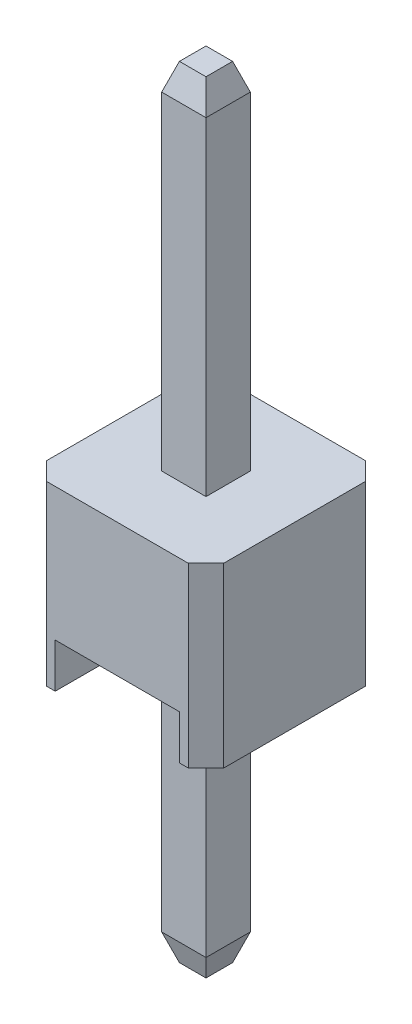
ISO-10303-21;
HEADER;
FILE_DESCRIPTION(('STEP AP214'),'2;1');
FILE_NAME('part.step','',(''),(''),'','','');
FILE_SCHEMA(('AUTOMOTIVE_DESIGN { 1 0 10303 214 1 1 1 1 }'));
ENDSEC;
DATA;
#1=APPLICATION_CONTEXT('core data for automotive mechanical design processes');
#2=APPLICATION_PROTOCOL_DEFINITION('international standard','automotive_design',2000,#1);
#3=PRODUCT_CONTEXT('',#1,'mechanical');
#4=PRODUCT('Part','Part','',(#3));
#5=PRODUCT_RELATED_PRODUCT_CATEGORY('part','',(#4));
#6=PRODUCT_DEFINITION_FORMATION('','',#4);
#7=PRODUCT_DEFINITION_CONTEXT('part definition',#1,'design');
#8=PRODUCT_DEFINITION('design','',#6,#7);
#9=PRODUCT_DEFINITION_SHAPE('','',#8);
#10=(LENGTH_UNIT() NAMED_UNIT(*) SI_UNIT(.MILLI.,.METRE.));
#11=(NAMED_UNIT(*) PLANE_ANGLE_UNIT() SI_UNIT($,.RADIAN.));
#12=(NAMED_UNIT(*) SI_UNIT($,.STERADIAN.) SOLID_ANGLE_UNIT());
#13=UNCERTAINTY_MEASURE_WITH_UNIT(LENGTH_MEASURE(1.E-05),#10,'distance_accuracy_value','');
#14=(GEOMETRIC_REPRESENTATION_CONTEXT(3) GLOBAL_UNCERTAINTY_ASSIGNED_CONTEXT((#13)) GLOBAL_UNIT_ASSIGNED_CONTEXT((#10,
#11,#12)) REPRESENTATION_CONTEXT('',''));
#15=CARTESIAN_POINT('',(0.,0.,0.));
#16=DIRECTION('',(0.,0.,1.));
#17=DIRECTION('',(1.,0.,0.));
#18=AXIS2_PLACEMENT_3D('',#15,#16,#17);
#19=CARTESIAN_POINT('',(1.261092051208,-0.01052284372211,3.146492385426));
#20=DIRECTION('',(0.,-0.316227766016653,0.948683298050575));
#21=DIRECTION('',(0.,0.948683298050575,0.316227766016653));
#22=AXIS2_PLACEMENT_3D('',#19,#20,#21);
#23=PLANE('',#22);
#24=DIRECTION('',(1.,0.,0.));
#25=VECTOR('',#24,1.);
#26=CARTESIAN_POINT('',(1.,0.,3.15));
#27=LINE('',#26,#25);
#28=CARTESIAN_POINT('',(0.849999999999959,0.,3.15));
#29=VERTEX_POINT('',#28);
#30=CARTESIAN_POINT('',(1.15000000000004,0.,3.15));
#31=VERTEX_POINT('',#30);
#32=EDGE_CURVE('E174',#29,#31,#27,.T.);
#33=ORIENTED_EDGE('',*,*,#32,.T.);
#34=DIRECTION('',(-0.301511344577576,-0.904534033733321,-0.301511344577863));
#35=VECTOR('',#34,1.);
#36=CARTESIAN_POINT('',(1.24999999999995,0.299999999999951,3.25));
#37=LINE('',#36,#35);
#38=CARTESIAN_POINT('',(1.24999999999998,0.30000000000004,3.25000000000002));
#39=VERTEX_POINT('',#38);
#40=EDGE_CURVE('E191',#39,#31,#37,.T.);
#41=ORIENTED_EDGE('',*,*,#40,.F.);
#42=DIRECTION('',(1.,0.,0.));
#43=VECTOR('',#42,1.);
#44=CARTESIAN_POINT('',(1.,0.3,3.25));
#45=LINE('',#44,#43);
#46=CARTESIAN_POINT('',(0.750000000000022,0.30000000000001,3.25000000000001));
#47=VERTEX_POINT('',#46);
#48=EDGE_CURVE('E188',#47,#39,#45,.T.);
#49=ORIENTED_EDGE('',*,*,#48,.F.);
#50=DIRECTION('',(-0.301511344577577,0.904534033733321,0.301511344577861));
#51=VECTOR('',#50,1.);
#52=CARTESIAN_POINT('',(0.849999999999953,0.,3.15));
#53=LINE('',#52,#51);
#54=EDGE_CURVE('E21',#29,#47,#53,.T.);
#55=ORIENTED_EDGE('',*,*,#54,.F.);
#56=EDGE_LOOP('',(#33,#41,#49,#55));
#57=FACE_BOUND('',#56,.T.);
#58=ADVANCED_FACE('F17',(#57),#23,.T.);
#59=CARTESIAN_POINT('',(1.161092051208,0.,2.838907948792));
#60=DIRECTION('',(0.,1.,0.));
#61=DIRECTION('',(-1.,0.,0.));
#62=AXIS2_PLACEMENT_3D('',#59,#60,#61);
#63=PLANE('',#62);
#64=DIRECTION('',(0.,0.,-1.));
#65=VECTOR('',#64,1.);
#66=CARTESIAN_POINT('',(1.15000000000005,0.,3.));
#67=LINE('',#66,#65);
#68=CARTESIAN_POINT('',(1.15000000000002,0.,2.84999999999995));
#69=VERTEX_POINT('',#68);
#70=EDGE_CURVE('E181',#31,#69,#67,.T.);
#71=ORIENTED_EDGE('',*,*,#70,.F.);
#72=ORIENTED_EDGE('',*,*,#32,.F.);
#73=DIRECTION('',(0.,0.,1.));
#74=VECTOR('',#73,1.);
#75=CARTESIAN_POINT('',(0.849999999999953,0.,3.));
#76=LINE('',#75,#74);
#77=CARTESIAN_POINT('',(0.849999999999976,0.,2.84999999999995));
#78=VERTEX_POINT('',#77);
#79=EDGE_CURVE('E178',#78,#29,#76,.T.);
#80=ORIENTED_EDGE('',*,*,#79,.F.);
#81=DIRECTION('',(-1.,0.,0.));
#82=VECTOR('',#81,1.);
#83=CARTESIAN_POINT('',(1.,0.,2.84999999999995));
#84=LINE('',#83,#82);
#85=EDGE_CURVE('E234',#69,#78,#84,.T.);
#86=ORIENTED_EDGE('',*,*,#85,.F.);
#87=EDGE_LOOP('',(#71,#72,#80,#86));
#88=FACE_BOUND('',#87,.T.);
#89=ADVANCED_FACE('F176',(#88),#63,.F.);
#90=CARTESIAN_POINT('',(0.853507614574,-0.01052284372211,3.261092051208));
#91=DIRECTION('',(-0.948683298050576,-0.316227766016652,0.));
#92=DIRECTION('',(-0.316227766016652,0.948683298050576,0.));
#93=AXIS2_PLACEMENT_3D('',#90,#91,#92);
#94=PLANE('',#93);
#95=DIRECTION('',(0.,0.,1.));
#96=VECTOR('',#95,1.);
#97=CARTESIAN_POINT('',(0.75,0.3,3.));
#98=LINE('',#97,#96);
#99=CARTESIAN_POINT('',(0.749999999999997,0.299999999999998,2.75000000000002));
#100=VERTEX_POINT('',#99);
#101=EDGE_CURVE('E205',#100,#47,#98,.T.);
#102=ORIENTED_EDGE('',*,*,#101,.F.);
#103=DIRECTION('',(-0.301511344577862,0.904534033733321,-0.301511344577576));
#104=VECTOR('',#103,1.);
#105=CARTESIAN_POINT('',(0.85,0.,2.84999999999995));
#106=LINE('',#105,#104);
#107=EDGE_CURVE('E194',#78,#100,#106,.T.);
#108=ORIENTED_EDGE('',*,*,#107,.F.);
#109=ORIENTED_EDGE('',*,*,#79,.T.);
#110=ORIENTED_EDGE('',*,*,#54,.T.);
#111=EDGE_LOOP('',(#102,#108,#109,#110));
#112=FACE_BOUND('',#111,.T.);
#113=ADVANCED_FACE('F192',(#112),#94,.T.);
#114=CARTESIAN_POINT('',(1.146492385426,-0.01052284372211,2.738907948792));
#115=DIRECTION('',(0.948683298050576,-0.316227766016651,0.));
#116=DIRECTION('',(0.316227766016651,0.948683298050576,0.));
#117=AXIS2_PLACEMENT_3D('',#114,#115,#116);
#118=PLANE('',#117);
#119=ORIENTED_EDGE('',*,*,#70,.T.);
#120=DIRECTION('',(-0.301511344577862,-0.904534033733321,0.301511344577576));
#121=VECTOR('',#120,1.);
#122=CARTESIAN_POINT('',(1.25,0.299999999999951,2.75000000000005));
#123=LINE('',#122,#121);
#124=CARTESIAN_POINT('',(1.25000000000002,0.300000000000041,2.75000000000002));
#125=VERTEX_POINT('',#124);
#126=EDGE_CURVE('E208',#125,#69,#123,.T.);
#127=ORIENTED_EDGE('',*,*,#126,.F.);
#128=DIRECTION('',(0.,0.,-1.));
#129=VECTOR('',#128,1.);
#130=CARTESIAN_POINT('',(1.25,0.3,3.));
#131=LINE('',#130,#129);
#132=EDGE_CURVE('E209',#39,#125,#131,.T.);
#133=ORIENTED_EDGE('',*,*,#132,.F.);
#134=ORIENTED_EDGE('',*,*,#40,.T.);
#135=EDGE_LOOP('',(#119,#127,#133,#134));
#136=FACE_BOUND('',#135,.T.);
#137=ADVANCED_FACE('F337',(#136),#118,.T.);
#138=CARTESIAN_POINT('',(0.738907948792,0.24,3.25));
#139=DIRECTION('',(0.,0.,1.));
#140=DIRECTION('',(1.,0.,0.));
#141=AXIS2_PLACEMENT_3D('',#138,#139,#140);
#142=PLANE('',#141);
#143=DIRECTION('',(-1.,0.,0.));
#144=VECTOR('',#143,1.);
#145=CARTESIAN_POINT('',(1.,3.3,3.25));
#146=LINE('',#145,#144);
#147=CARTESIAN_POINT('',(1.25,3.3,3.25000000000001));
#148=VERTEX_POINT('',#147);
#149=CARTESIAN_POINT('',(0.74999999999998,3.3,3.25));
#150=VERTEX_POINT('',#149);
#151=EDGE_CURVE('E200',#148,#150,#146,.T.);
#152=ORIENTED_EDGE('',*,*,#151,.T.);
#153=DIRECTION('',(0.,1.,0.));
#154=VECTOR('',#153,1.);
#155=CARTESIAN_POINT('',(0.75,1.8,3.25));
#156=LINE('',#155,#154);
#157=EDGE_CURVE('E201',#47,#150,#156,.T.);
#158=ORIENTED_EDGE('',*,*,#157,.F.);
#159=ORIENTED_EDGE('',*,*,#48,.T.);
#160=DIRECTION('',(0.,-1.,0.));
#161=VECTOR('',#160,1.);
#162=CARTESIAN_POINT('',(1.25,1.8,3.25000000000004));
#163=LINE('',#162,#161);
#164=EDGE_CURVE('E213',#148,#39,#163,.T.);
#165=ORIENTED_EDGE('',*,*,#164,.F.);
#166=EDGE_LOOP('',(#152,#158,#159,#165));
#167=FACE_BOUND('',#166,.T.);
#168=ADVANCED_FACE('F343',(#167),#142,.T.);
#169=CARTESIAN_POINT('',(2.04,2.8,1.96));
#170=DIRECTION('',(0.,1.,0.));
#171=DIRECTION('',(-1.,0.,0.));
#172=AXIS2_PLACEMENT_3D('',#169,#170,#171);
#173=PLANE('',#172);
#174=DIRECTION('',(-0.707106781186548,0.,0.707106781186547));
#175=VECTOR('',#174,1.);
#176=CARTESIAN_POINT('',(2.007843264626,2.8,3.792156735374));
#177=LINE('',#176,#175);
#178=CARTESIAN_POINT('',(1.80000000000021,2.8,3.99999999999979));
#179=VERTEX_POINT('',#178);
#180=CARTESIAN_POINT('',(2.,2.8,3.8));
#181=VERTEX_POINT('',#180);
#182=EDGE_CURVE('E220',#179,#181,#177,.F.);
#183=ORIENTED_EDGE('',*,*,#182,.F.);
#184=DIRECTION('',(1.,0.,0.));
#185=VECTOR('',#184,1.);
#186=CARTESIAN_POINT('',(1.,2.8,4.));
#187=LINE('',#186,#185);
#188=CARTESIAN_POINT('',(1.7,2.8,4.));
#189=VERTEX_POINT('',#188);
#190=EDGE_CURVE('E218',#189,#179,#187,.T.);
#191=ORIENTED_EDGE('',*,*,#190,.F.);
#192=DIRECTION('',(0.,0.,-1.));
#193=VECTOR('',#192,1.);
#194=CARTESIAN_POINT('',(1.7,2.8,3.));
#195=LINE('',#194,#193);
#196=CARTESIAN_POINT('',(1.7,2.8,2.));
#197=VERTEX_POINT('',#196);
#198=EDGE_CURVE('E216',#189,#197,#195,.T.);
#199=ORIENTED_EDGE('',*,*,#198,.T.);
#200=DIRECTION('',(-1.,0.,0.));
#201=VECTOR('',#200,1.);
#202=CARTESIAN_POINT('',(1.,2.8,2.));
#203=LINE('',#202,#201);
#204=CARTESIAN_POINT('',(1.80000000000021,2.8,2.00000000000021));
#205=VERTEX_POINT('',#204);
#206=EDGE_CURVE('E221',#205,#197,#203,.T.);
#207=ORIENTED_EDGE('',*,*,#206,.F.);
#208=DIRECTION('',(0.707106781186547,0.,0.707106781186548));
#209=VECTOR('',#208,1.);
#210=CARTESIAN_POINT('',(1.792156735374,2.8,1.992156735374));
#211=LINE('',#210,#209);
#212=CARTESIAN_POINT('',(2.,2.8,2.2));
#213=VERTEX_POINT('',#212);
#214=EDGE_CURVE('E244',#213,#205,#211,.F.);
#215=ORIENTED_EDGE('',*,*,#214,.F.);
#216=DIRECTION('',(0.,0.,-1.));
#217=VECTOR('',#216,1.);
#218=CARTESIAN_POINT('',(2.,2.8,3.));
#219=LINE('',#218,#217);
#220=EDGE_CURVE('E232',#181,#213,#219,.T.);
#221=ORIENTED_EDGE('',*,*,#220,.F.);
#222=EDGE_LOOP('',(#183,#191,#199,#207,#215,#221));
#223=FACE_BOUND('',#222,.T.);
#224=ADVANCED_FACE('F385',(#223),#173,.F.);
#225=CARTESIAN_POINT('',(0.738907948792,-0.01052284372211,2.853507614574));
#226=DIRECTION('',(0.,-0.316227766016651,-0.948683298050576));
#227=DIRECTION('',(0.,0.948683298050576,-0.316227766016651));
#228=AXIS2_PLACEMENT_3D('',#225,#226,#227);
#229=PLANE('',#228);
#230=DIRECTION('',(-1.,0.,0.));
#231=VECTOR('',#230,1.);
#232=CARTESIAN_POINT('',(1.,0.3,2.75));
#233=LINE('',#232,#231);
#234=EDGE_CURVE('E245',#125,#100,#233,.T.);
#235=ORIENTED_EDGE('',*,*,#234,.F.);
#236=ORIENTED_EDGE('',*,*,#126,.T.);
#237=ORIENTED_EDGE('',*,*,#85,.T.);
#238=ORIENTED_EDGE('',*,*,#107,.T.);
#239=EDGE_LOOP('',(#235,#236,#237,#238));
#240=FACE_BOUND('',#239,.T.);
#241=ADVANCED_FACE('F361',(#240),#229,.T.);
#242=CARTESIAN_POINT('',(0.75,0.24,2.738907948792));
#243=DIRECTION('',(-1.,0.,0.));
#244=DIRECTION('',(0.,0.,1.));
#245=AXIS2_PLACEMENT_3D('',#242,#243,#244);
#246=PLANE('',#245);
#247=DIRECTION('',(0.,0.,-1.));
#248=VECTOR('',#247,1.);
#249=CARTESIAN_POINT('',(0.75,3.3,3.));
#250=LINE('',#249,#248);
#251=CARTESIAN_POINT('',(0.75,3.3,2.74999999999998));
#252=VERTEX_POINT('',#251);
#253=EDGE_CURVE('E204',#150,#252,#250,.T.);
#254=ORIENTED_EDGE('',*,*,#253,.T.);
#255=DIRECTION('',(0.,1.,0.));
#256=VECTOR('',#255,1.);
#257=CARTESIAN_POINT('',(0.750000000000001,1.8,2.75));
#258=LINE('',#257,#256);
#259=EDGE_CURVE('E248',#100,#252,#258,.T.);
#260=ORIENTED_EDGE('',*,*,#259,.F.);
#261=ORIENTED_EDGE('',*,*,#101,.T.);
#262=ORIENTED_EDGE('',*,*,#157,.T.);
#263=EDGE_LOOP('',(#254,#260,#261,#262));
#264=FACE_BOUND('',#263,.T.);
#265=ADVANCED_FACE('F359',(#264),#246,.T.);
#266=CARTESIAN_POINT('',(1.25,0.24,3.261092051208));
#267=DIRECTION('',(1.,0.,0.));
#268=DIRECTION('',(0.,0.,-1.));
#269=AXIS2_PLACEMENT_3D('',#266,#267,#268);
#270=PLANE('',#269);
#271=DIRECTION('',(0.,0.,1.));
#272=VECTOR('',#271,1.);
#273=CARTESIAN_POINT('',(1.25,3.3,3.));
#274=LINE('',#273,#272);
#275=CARTESIAN_POINT('',(1.25000000000001,3.3,2.75));
#276=VERTEX_POINT('',#275);
#277=EDGE_CURVE('E212',#276,#148,#274,.T.);
#278=ORIENTED_EDGE('',*,*,#277,.T.);
#279=ORIENTED_EDGE('',*,*,#164,.T.);
#280=ORIENTED_EDGE('',*,*,#132,.T.);
#281=DIRECTION('',(0.,-1.,0.));
#282=VECTOR('',#281,1.);
#283=CARTESIAN_POINT('',(1.25000000000004,1.8,2.75));
#284=LINE('',#283,#282);
#285=EDGE_CURVE('E250',#276,#125,#284,.T.);
#286=ORIENTED_EDGE('',*,*,#285,.F.);
#287=EDGE_LOOP('',(#278,#279,#280,#286));
#288=FACE_BOUND('',#287,.T.);
#289=ADVANCED_FACE('F345',(#288),#270,.T.);
#290=CARTESIAN_POINT('',(1.7,3.311092051208,4.04));
#291=DIRECTION('',(1.,0.,0.));
#292=DIRECTION('',(0.,-1.,0.));
#293=AXIS2_PLACEMENT_3D('',#290,#291,#292);
#294=PLANE('',#293);
#295=DIRECTION('',(0.,0.,-1.));
#296=VECTOR('',#295,1.);
#297=CARTESIAN_POINT('',(1.7,3.3,3.));
#298=LINE('',#297,#296);
#299=CARTESIAN_POINT('',(1.7,3.30000000000001,4.));
#300=VERTEX_POINT('',#299);
#301=CARTESIAN_POINT('',(1.7,3.30000000000001,2.));
#302=VERTEX_POINT('',#301);
#303=EDGE_CURVE('E365',#300,#302,#298,.T.);
#304=ORIENTED_EDGE('',*,*,#303,.T.);
#305=DIRECTION('',(0.,1.,0.));
#306=VECTOR('',#305,1.);
#307=CARTESIAN_POINT('',(1.7,3.05,2.));
#308=LINE('',#307,#306);
#309=EDGE_CURVE('E377',#197,#302,#308,.T.);
#310=ORIENTED_EDGE('',*,*,#309,.F.);
#311=ORIENTED_EDGE('',*,*,#198,.F.);
#312=DIRECTION('',(0.,-1.,0.));
#313=VECTOR('',#312,1.);
#314=CARTESIAN_POINT('',(1.7,3.05,4.));
#315=LINE('',#314,#313);
#316=EDGE_CURVE('E249',#300,#189,#315,.T.);
#317=ORIENTED_EDGE('',*,*,#316,.F.);
#318=EDGE_LOOP('',(#304,#310,#311,#317));
#319=FACE_BOUND('',#318,.T.);
#320=ADVANCED_FACE('F389',(#319),#294,.F.);
#321=CARTESIAN_POINT('',(1.261092051208,0.24,2.75));
#322=DIRECTION('',(0.,0.,-1.));
#323=DIRECTION('',(-1.,0.,0.));
#324=AXIS2_PLACEMENT_3D('',#321,#322,#323);
#325=PLANE('',#324);
#326=DIRECTION('',(1.,0.,0.));
#327=VECTOR('',#326,1.);
#328=CARTESIAN_POINT('',(1.,3.3,2.75));
#329=LINE('',#328,#327);
#330=EDGE_CURVE('E356',#252,#276,#329,.T.);
#331=ORIENTED_EDGE('',*,*,#330,.T.);
#332=ORIENTED_EDGE('',*,*,#285,.T.);
#333=ORIENTED_EDGE('',*,*,#234,.T.);
#334=ORIENTED_EDGE('',*,*,#259,.T.);
#335=EDGE_LOOP('',(#331,#332,#333,#334));
#336=FACE_BOUND('',#335,.T.);
#337=ADVANCED_FACE('F363',(#336),#325,.T.);
#338=CARTESIAN_POINT('',(0.272,3.3,4.04));
#339=DIRECTION('',(0.,1.,0.));
#340=DIRECTION('',(1.,0.,0.));
#341=AXIS2_PLACEMENT_3D('',#338,#339,#340);
#342=PLANE('',#341);
#343=ORIENTED_EDGE('',*,*,#253,.F.);
#344=ORIENTED_EDGE('',*,*,#151,.F.);
#345=ORIENTED_EDGE('',*,*,#277,.F.);
#346=ORIENTED_EDGE('',*,*,#330,.F.);
#347=EDGE_LOOP('',(#343,#344,#345,#346));
#348=FACE_BOUND('',#347,.T.);
#349=DIRECTION('',(1.,0.,0.));
#350=VECTOR('',#349,1.);
#351=CARTESIAN_POINT('',(1.,3.3,4.));
#352=LINE('',#351,#350);
#353=CARTESIAN_POINT('',(0.3,3.3,4.));
#354=VERTEX_POINT('',#353);
#355=EDGE_CURVE('E370',#354,#300,#352,.T.);
#356=ORIENTED_EDGE('',*,*,#355,.F.);
#357=DIRECTION('',(0.,0.,-1.));
#358=VECTOR('',#357,1.);
#359=CARTESIAN_POINT('',(0.3,3.3,3.));
#360=LINE('',#359,#358);
#361=CARTESIAN_POINT('',(0.3,3.3,2.));
#362=VERTEX_POINT('',#361);
#363=EDGE_CURVE('E367',#354,#362,#360,.T.);
#364=ORIENTED_EDGE('',*,*,#363,.T.);
#365=DIRECTION('',(-1.,0.,0.));
#366=VECTOR('',#365,1.);
#367=CARTESIAN_POINT('',(1.,3.3,2.));
#368=LINE('',#367,#366);
#369=EDGE_CURVE('E253',#302,#362,#368,.T.);
#370=ORIENTED_EDGE('',*,*,#369,.F.);
#371=ORIENTED_EDGE('',*,*,#303,.F.);
#372=EDGE_LOOP('',(#356,#364,#370,#371));
#373=FACE_BOUND('',#372,.T.);
#374=ADVANCED_FACE('F354',(#348,#373),#342,.F.);
#375=CARTESIAN_POINT('',(0.3,2.788907948792,4.04));
#376=DIRECTION('',(-1.,0.,0.));
#377=DIRECTION('',(0.,1.,0.));
#378=AXIS2_PLACEMENT_3D('',#375,#376,#377);
#379=PLANE('',#378);
#380=ORIENTED_EDGE('',*,*,#363,.F.);
#381=DIRECTION('',(0.,1.,0.));
#382=VECTOR('',#381,1.);
#383=CARTESIAN_POINT('',(0.3,3.05,4.));
#384=LINE('',#383,#382);
#385=CARTESIAN_POINT('',(0.3,2.79999999999999,4.));
#386=VERTEX_POINT('',#385);
#387=EDGE_CURVE('E364',#386,#354,#384,.T.);
#388=ORIENTED_EDGE('',*,*,#387,.F.);
#389=DIRECTION('',(0.,0.,-1.));
#390=VECTOR('',#389,1.);
#391=CARTESIAN_POINT('',(0.3,2.8,3.));
#392=LINE('',#391,#390);
#393=CARTESIAN_POINT('',(0.3,2.79999999999998,2.));
#394=VERTEX_POINT('',#393);
#395=EDGE_CURVE('E274',#386,#394,#392,.T.);
#396=ORIENTED_EDGE('',*,*,#395,.T.);
#397=DIRECTION('',(0.,-1.,0.));
#398=VECTOR('',#397,1.);
#399=CARTESIAN_POINT('',(0.3,3.05,2.));
#400=LINE('',#399,#398);
#401=EDGE_CURVE('E330',#362,#394,#400,.T.);
#402=ORIENTED_EDGE('',*,*,#401,.F.);
#403=EDGE_LOOP('',(#380,#388,#396,#402));
#404=FACE_BOUND('',#403,.T.);
#405=ADVANCED_FACE('F404',(#404),#379,.F.);
#406=CARTESIAN_POINT('',(2.04,2.8,1.96));
#407=DIRECTION('',(0.,1.,0.));
#408=DIRECTION('',(-1.,0.,0.));
#409=AXIS2_PLACEMENT_3D('',#406,#407,#408);
#410=PLANE('',#409);
#411=ORIENTED_EDGE('',*,*,#395,.F.);
#412=DIRECTION('',(1.,0.,0.));
#413=VECTOR('',#412,1.);
#414=CARTESIAN_POINT('',(1.,2.8,4.));
#415=LINE('',#414,#413);
#416=CARTESIAN_POINT('',(0.200000000000185,2.8,4.));
#417=VERTEX_POINT('',#416);
#418=EDGE_CURVE('E272',#417,#386,#415,.T.);
#419=ORIENTED_EDGE('',*,*,#418,.F.);
#420=DIRECTION('',(-0.707106781187888,0.,-0.707106781185207));
#421=VECTOR('',#420,1.);
#422=CARTESIAN_POINT('',(0.2078432646264,2.8,4.007843264626));
#423=LINE('',#422,#421);
#424=CARTESIAN_POINT('',(0.,2.8,3.8000000000004));
#425=VERTEX_POINT('',#424);
#426=EDGE_CURVE('E275',#425,#417,#423,.F.);
#427=ORIENTED_EDGE('',*,*,#426,.F.);
#428=DIRECTION('',(0.,0.,1.));
#429=VECTOR('',#428,1.);
#430=CARTESIAN_POINT('',(0.,2.8,3.));
#431=LINE('',#430,#429);
#432=CARTESIAN_POINT('',(0.,2.8,2.1999999999996));
#433=VERTEX_POINT('',#432);
#434=EDGE_CURVE('E257',#433,#425,#431,.T.);
#435=ORIENTED_EDGE('',*,*,#434,.F.);
#436=DIRECTION('',(0.707106781187887,0.,-0.707106781185208));
#437=VECTOR('',#436,1.);
#438=CARTESIAN_POINT('',(-0.007843264626417,2.8,2.207843264626));
#439=LINE('',#438,#437);
#440=CARTESIAN_POINT('',(0.200000000000185,2.8,2.));
#441=VERTEX_POINT('',#440);
#442=EDGE_CURVE('E328',#441,#433,#439,.F.);
#443=ORIENTED_EDGE('',*,*,#442,.F.);
#444=DIRECTION('',(-1.,0.,0.));
#445=VECTOR('',#444,1.);
#446=CARTESIAN_POINT('',(1.,2.8,2.));
#447=LINE('',#446,#445);
#448=EDGE_CURVE('E261',#394,#441,#447,.T.);
#449=ORIENTED_EDGE('',*,*,#448,.F.);
#450=EDGE_LOOP('',(#411,#419,#427,#435,#443,#449));
#451=FACE_BOUND('',#450,.T.);
#452=ADVANCED_FACE('F409',(#451),#410,.F.);
#453=CARTESIAN_POINT('',(0.,2.76,2.168));
#454=DIRECTION('',(-1.,0.,0.));
#455=DIRECTION('',(0.,0.,1.));
#456=AXIS2_PLACEMENT_3D('',#453,#454,#455);
#457=PLANE('',#456);
#458=DIRECTION('',(0.,-1.,0.));
#459=VECTOR('',#458,1.);
#460=CARTESIAN_POINT('',(0.,3.8,3.80000000000041));
#461=LINE('',#460,#459);
#462=CARTESIAN_POINT('',(0.,4.8,3.8000000000001));
#463=VERTEX_POINT('',#462);
#464=EDGE_CURVE('E262',#463,#425,#461,.T.);
#465=ORIENTED_EDGE('',*,*,#464,.F.);
#466=DIRECTION('',(0.,0.,-1.));
#467=VECTOR('',#466,1.);
#468=CARTESIAN_POINT('',(0.,4.8,3.));
#469=LINE('',#468,#467);
#470=CARTESIAN_POINT('',(0.,4.8,2.1999999999999));
#471=VERTEX_POINT('',#470);
#472=EDGE_CURVE('E260',#463,#471,#469,.T.);
#473=ORIENTED_EDGE('',*,*,#472,.T.);
#474=DIRECTION('',(0.,1.,0.));
#475=VECTOR('',#474,1.);
#476=CARTESIAN_POINT('',(0.,3.8,2.19999999999959));
#477=LINE('',#476,#475);
#478=EDGE_CURVE('E280',#433,#471,#477,.T.);
#479=ORIENTED_EDGE('',*,*,#478,.F.);
#480=ORIENTED_EDGE('',*,*,#434,.T.);
#481=EDGE_LOOP('',(#465,#473,#479,#480));
#482=FACE_BOUND('',#481,.T.);
#483=ADVANCED_FACE('F620',(#482),#457,.T.);
#484=CARTESIAN_POINT('',(-0.007843264626417,4.84,2.207843264626));
#485=DIRECTION('',(-0.707106781185208,0.,-0.707106781187887));
#486=DIRECTION('',(0.707106781187887,0.,-0.707106781185208));
#487=AXIS2_PLACEMENT_3D('',#484,#485,#486);
#488=PLANE('',#487);
#489=DIRECTION('',(0.707106781187887,0.,-0.707106781185208));
#490=VECTOR('',#489,1.);
#491=CARTESIAN_POINT('',(0.0999999999999915,4.8,2.1));
#492=LINE('',#491,#490);
#493=CARTESIAN_POINT('',(0.199999999999979,4.8,2.00000000000021));
#494=VERTEX_POINT('',#493);
#495=EDGE_CURVE('E283',#471,#494,#492,.T.);
#496=ORIENTED_EDGE('',*,*,#495,.T.);
#497=DIRECTION('',(0.,1.,0.));
#498=VECTOR('',#497,1.);
#499=CARTESIAN_POINT('',(0.2,3.8,2.));
#500=LINE('',#499,#498);
#501=EDGE_CURVE('E265',#441,#494,#500,.T.);
#502=ORIENTED_EDGE('',*,*,#501,.F.);
#503=ORIENTED_EDGE('',*,*,#442,.T.);
#504=ORIENTED_EDGE('',*,*,#478,.T.);
#505=EDGE_LOOP('',(#496,#502,#503,#504));
#506=FACE_BOUND('',#505,.T.);
#507=ADVANCED_FACE('F413',(#506),#488,.T.);
#508=CARTESIAN_POINT('',(0.2078432646264,4.84,4.007843264626));
#509=DIRECTION('',(-0.707106781185207,0.,0.707106781187888));
#510=DIRECTION('',(-0.707106781187888,0.,-0.707106781185207));
#511=AXIS2_PLACEMENT_3D('',#508,#509,#510);
#512=PLANE('',#511);
#513=DIRECTION('',(-0.707106781187889,0.,-0.707106781185206));
#514=VECTOR('',#513,1.);
#515=CARTESIAN_POINT('',(0.0999999999999915,4.8,3.9));
#516=LINE('',#515,#514);
#517=CARTESIAN_POINT('',(0.199999999999989,4.8,3.9999999999999));
#518=VERTEX_POINT('',#517);
#519=EDGE_CURVE('E266',#518,#463,#516,.T.);
#520=ORIENTED_EDGE('',*,*,#519,.T.);
#521=ORIENTED_EDGE('',*,*,#464,.T.);
#522=ORIENTED_EDGE('',*,*,#426,.T.);
#523=DIRECTION('',(0.,-1.,0.));
#524=VECTOR('',#523,1.);
#525=CARTESIAN_POINT('',(0.2,3.8,4.));
#526=LINE('',#525,#524);
#527=EDGE_CURVE('E267',#518,#417,#526,.T.);
#528=ORIENTED_EDGE('',*,*,#527,.F.);
#529=EDGE_LOOP('',(#520,#521,#522,#528));
#530=FACE_BOUND('',#529,.T.);
#531=ADVANCED_FACE('F604',(#530),#512,.T.);
#532=CARTESIAN_POINT('',(0.738907948792,8.810522843722,3.146492385426));
#533=DIRECTION('',(0.,0.316227766016839,0.948683298050514));
#534=DIRECTION('',(0.,-0.948683298050514,0.316227766016839));
#535=AXIS2_PLACEMENT_3D('',#532,#533,#534);
#536=PLANE('',#535);
#537=DIRECTION('',(-1.,0.,0.));
#538=VECTOR('',#537,1.);
#539=CARTESIAN_POINT('',(1.,8.5,3.25));
#540=LINE('',#539,#538);
#541=CARTESIAN_POINT('',(1.25,8.5,3.25000000000002));
#542=VERTEX_POINT('',#541);
#543=CARTESIAN_POINT('',(0.750000000000006,8.50000000000004,3.25000000000003));
#544=VERTEX_POINT('',#543);
#545=EDGE_CURVE('E289',#542,#544,#540,.T.);
#546=ORIENTED_EDGE('',*,*,#545,.F.);
#547=DIRECTION('',(0.301511344577737,-0.904534033733213,0.301511344578023));
#548=VECTOR('',#547,1.);
#549=CARTESIAN_POINT('',(1.15000000000005,8.79999999999986,3.15));
#550=LINE('',#549,#548);
#551=CARTESIAN_POINT('',(1.15000000000003,8.79999999999993,3.14999999999999));
#552=VERTEX_POINT('',#551);
#553=EDGE_CURVE('E288',#552,#542,#550,.T.);
#554=ORIENTED_EDGE('',*,*,#553,.F.);
#555=DIRECTION('',(1.,0.,0.));
#556=VECTOR('',#555,1.);
#557=CARTESIAN_POINT('',(1.,8.8,3.15));
#558=LINE('',#557,#556);
#559=CARTESIAN_POINT('',(0.849999999999974,8.79999999999993,3.14999999999999));
#560=VERTEX_POINT('',#559);
#561=EDGE_CURVE('E270',#560,#552,#558,.T.);
#562=ORIENTED_EDGE('',*,*,#561,.F.);
#563=DIRECTION('',(0.301511344577738,0.904534033733213,-0.301511344578023));
#564=VECTOR('',#563,1.);
#565=CARTESIAN_POINT('',(0.750000000000048,8.50000000000014,3.25));
#566=LINE('',#565,#564);
#567=EDGE_CURVE('E307',#544,#560,#566,.T.);
#568=ORIENTED_EDGE('',*,*,#567,.F.);
#569=EDGE_LOOP('',(#546,#554,#562,#568));
#570=FACE_BOUND('',#569,.T.);
#571=ADVANCED_FACE('F463',(#570),#536,.T.);
#572=CARTESIAN_POINT('',(1.832,2.76,2.));
#573=DIRECTION('',(0.,0.,-1.));
#574=DIRECTION('',(-1.,0.,0.));
#575=AXIS2_PLACEMENT_3D('',#572,#573,#574);
#576=PLANE('',#575);
#577=ORIENTED_EDGE('',*,*,#501,.T.);
#578=DIRECTION('',(1.,0.,0.));
#579=VECTOR('',#578,1.);
#580=CARTESIAN_POINT('',(1.,4.8,2.));
#581=LINE('',#580,#579);
#582=CARTESIAN_POINT('',(1.8000000000001,4.8,2.0000000000001));
#583=VERTEX_POINT('',#582);
#584=EDGE_CURVE('E279',#494,#583,#581,.T.);
#585=ORIENTED_EDGE('',*,*,#584,.T.);
#586=DIRECTION('',(0.,1.,0.));
#587=VECTOR('',#586,1.);
#588=CARTESIAN_POINT('',(1.80000000000041,3.8,2.00000000000041));
#589=LINE('',#588,#587);
#590=EDGE_CURVE('E238',#205,#583,#589,.T.);
#591=ORIENTED_EDGE('',*,*,#590,.F.);
#592=ORIENTED_EDGE('',*,*,#206,.T.);
#593=ORIENTED_EDGE('',*,*,#309,.T.);
#594=ORIENTED_EDGE('',*,*,#369,.T.);
#595=ORIENTED_EDGE('',*,*,#401,.T.);
#596=ORIENTED_EDGE('',*,*,#448,.T.);
#597=EDGE_LOOP('',(#577,#585,#591,#592,#593,#594,#595,#596));
#598=FACE_BOUND('',#597,.T.);
#599=ADVANCED_FACE('F396',(#598),#576,.T.);
#600=CARTESIAN_POINT('',(0.168,2.76,4.));
#601=DIRECTION('',(0.,0.,1.));
#602=DIRECTION('',(1.,0.,0.));
#603=AXIS2_PLACEMENT_3D('',#600,#601,#602);
#604=PLANE('',#603);
#605=ORIENTED_EDGE('',*,*,#316,.T.);
#606=ORIENTED_EDGE('',*,*,#190,.T.);
#607=DIRECTION('',(0.,-1.,0.));
#608=VECTOR('',#607,1.);
#609=CARTESIAN_POINT('',(1.80000000000041,3.8,3.99999999999959));
#610=LINE('',#609,#608);
#611=CARTESIAN_POINT('',(1.8000000000001,4.8,3.9999999999999));
#612=VERTEX_POINT('',#611);
#613=EDGE_CURVE('E222',#612,#179,#610,.T.);
#614=ORIENTED_EDGE('',*,*,#613,.F.);
#615=DIRECTION('',(-1.,0.,0.));
#616=VECTOR('',#615,1.);
#617=CARTESIAN_POINT('',(1.,4.8,4.));
#618=LINE('',#617,#616);
#619=EDGE_CURVE('E271',#612,#518,#618,.T.);
#620=ORIENTED_EDGE('',*,*,#619,.T.);
#621=ORIENTED_EDGE('',*,*,#527,.T.);
#622=ORIENTED_EDGE('',*,*,#418,.T.);
#623=ORIENTED_EDGE('',*,*,#387,.T.);
#624=ORIENTED_EDGE('',*,*,#355,.T.);
#625=EDGE_LOOP('',(#605,#606,#614,#620,#621,#622,#623,#624));
#626=FACE_BOUND('',#625,.T.);
#627=ADVANCED_FACE('F436',(#626),#604,.T.);
#628=CARTESIAN_POINT('',(1.161092051208,8.8,2.838907948792));
#629=DIRECTION('',(0.,1.,0.));
#630=DIRECTION('',(-1.,0.,0.));
#631=AXIS2_PLACEMENT_3D('',#628,#629,#630);
#632=PLANE('',#631);
#633=ORIENTED_EDGE('',*,*,#561,.T.);
#634=DIRECTION('',(0.,0.,1.));
#635=VECTOR('',#634,1.);
#636=CARTESIAN_POINT('',(1.15000000000005,8.79999999999986,3.));
#637=LINE('',#636,#635);
#638=CARTESIAN_POINT('',(1.15000000000002,8.79999999999986,2.84999999999995));
#639=VERTEX_POINT('',#638);
#640=EDGE_CURVE('E285',#639,#552,#637,.T.);
#641=ORIENTED_EDGE('',*,*,#640,.F.);
#642=DIRECTION('',(1.,0.,0.));
#643=VECTOR('',#642,1.);
#644=CARTESIAN_POINT('',(1.,8.79999999999986,2.84999999999995));
#645=LINE('',#644,#643);
#646=CARTESIAN_POINT('',(0.849999999999977,8.79999999999986,2.84999999999995));
#647=VERTEX_POINT('',#646);
#648=EDGE_CURVE('E308',#647,#639,#645,.T.);
#649=ORIENTED_EDGE('',*,*,#648,.F.);
#650=DIRECTION('',(0.,0.,-1.));
#651=VECTOR('',#650,1.);
#652=CARTESIAN_POINT('',(0.849999999999953,8.79999999999986,3.));
#653=LINE('',#652,#651);
#654=EDGE_CURVE('E292',#560,#647,#653,.T.);
#655=ORIENTED_EDGE('',*,*,#654,.F.);
#656=EDGE_LOOP('',(#633,#641,#649,#655));
#657=FACE_BOUND('',#656,.T.);
#658=ADVANCED_FACE('F469',(#657),#632,.T.);
#659=CARTESIAN_POINT('',(1.146492385426,8.810522843722,3.261092051208));
#660=DIRECTION('',(0.948683298050514,0.316227766016837,0.));
#661=DIRECTION('',(0.316227766016837,-0.948683298050514,0.));
#662=AXIS2_PLACEMENT_3D('',#659,#660,#661);
#663=PLANE('',#662);
#664=ORIENTED_EDGE('',*,*,#640,.T.);
#665=ORIENTED_EDGE('',*,*,#553,.T.);
#666=DIRECTION('',(0.,0.,1.));
#667=VECTOR('',#666,1.);
#668=CARTESIAN_POINT('',(1.25,8.5,3.));
#669=LINE('',#668,#667);
#670=CARTESIAN_POINT('',(1.25000000000002,8.5,2.75));
#671=VERTEX_POINT('',#670);
#672=EDGE_CURVE('E297',#671,#542,#669,.T.);
#673=ORIENTED_EDGE('',*,*,#672,.F.);
#674=DIRECTION('',(0.301511344578024,-0.904534033733213,-0.301511344577737));
#675=VECTOR('',#674,1.);
#676=CARTESIAN_POINT('',(1.15,8.79999999999986,2.84999999999995));
#677=LINE('',#676,#675);
#678=EDGE_CURVE('E300',#639,#671,#677,.T.);
#679=ORIENTED_EDGE('',*,*,#678,.F.);
#680=EDGE_LOOP('',(#664,#665,#673,#679));
#681=FACE_BOUND('',#680,.T.);
#682=ADVANCED_FACE('F465',(#681),#663,.T.);
#683=CARTESIAN_POINT('',(0.853507614574,8.810522843722,2.738907948792));
#684=DIRECTION('',(-0.948683298050514,0.316227766016838,0.));
#685=DIRECTION('',(-0.316227766016838,-0.948683298050514,0.));
#686=AXIS2_PLACEMENT_3D('',#683,#684,#685);
#687=PLANE('',#686);
#688=ORIENTED_EDGE('',*,*,#654,.T.);
#689=DIRECTION('',(0.301511344578024,0.904534033733213,0.301511344577737));
#690=VECTOR('',#689,1.);
#691=CARTESIAN_POINT('',(0.75,8.50000000000014,2.75000000000005));
#692=LINE('',#691,#690);
#693=CARTESIAN_POINT('',(0.749999999999971,8.50000000000004,2.75000000000001));
#694=VERTEX_POINT('',#693);
#695=EDGE_CURVE('E225',#694,#647,#692,.T.);
#696=ORIENTED_EDGE('',*,*,#695,.F.);
#697=DIRECTION('',(0.,0.,-1.));
#698=VECTOR('',#697,1.);
#699=CARTESIAN_POINT('',(0.75,8.5,3.));
#700=LINE('',#699,#698);
#701=EDGE_CURVE('E301',#544,#694,#700,.T.);
#702=ORIENTED_EDGE('',*,*,#701,.F.);
#703=ORIENTED_EDGE('',*,*,#567,.T.);
#704=EDGE_LOOP('',(#688,#696,#702,#703));
#705=FACE_BOUND('',#704,.T.);
#706=ADVANCED_FACE('F472',(#705),#687,.T.);
#707=CARTESIAN_POINT('',(0.738907948792,4.726,3.25));
#708=DIRECTION('',(0.,0.,1.));
#709=DIRECTION('',(1.,0.,0.));
#710=AXIS2_PLACEMENT_3D('',#707,#708,#709);
#711=PLANE('',#710);
#712=DIRECTION('',(1.,0.,0.));
#713=VECTOR('',#712,1.);
#714=CARTESIAN_POINT('',(1.,4.8,3.25));
#715=LINE('',#714,#713);
#716=CARTESIAN_POINT('',(0.74999999999999,4.8,3.25));
#717=VERTEX_POINT('',#716);
#718=CARTESIAN_POINT('',(1.25,4.8,3.25000000000001));
#719=VERTEX_POINT('',#718);
#720=EDGE_CURVE('E242',#717,#719,#715,.T.);
#721=ORIENTED_EDGE('',*,*,#720,.T.);
#722=DIRECTION('',(0.,-1.,0.));
#723=VECTOR('',#722,1.);
#724=CARTESIAN_POINT('',(1.25,6.65,3.25000000000004));
#725=LINE('',#724,#723);
#726=EDGE_CURVE('E293',#542,#719,#725,.T.);
#727=ORIENTED_EDGE('',*,*,#726,.F.);
#728=ORIENTED_EDGE('',*,*,#545,.T.);
#729=DIRECTION('',(0.,1.,0.));
#730=VECTOR('',#729,1.);
#731=CARTESIAN_POINT('',(0.75,6.65,3.25));
#732=LINE('',#731,#730);
#733=EDGE_CURVE('E237',#717,#544,#732,.T.);
#734=ORIENTED_EDGE('',*,*,#733,.F.);
#735=EDGE_LOOP('',(#721,#727,#728,#734));
#736=FACE_BOUND('',#735,.T.);
#737=ADVANCED_FACE('F460',(#736),#711,.T.);
#738=CARTESIAN_POINT('',(1.792156735374,4.84,1.992156735374));
#739=DIRECTION('',(0.707106781186548,0.,-0.707106781186547));
#740=DIRECTION('',(0.707106781186547,0.,0.707106781186548));
#741=AXIS2_PLACEMENT_3D('',#738,#739,#740);
#742=PLANE('',#741);
#743=DIRECTION('',(0.707106781186547,0.,0.707106781186548));
#744=VECTOR('',#743,1.);
#745=CARTESIAN_POINT('',(1.9,4.8,2.1));
#746=LINE('',#745,#744);
#747=CARTESIAN_POINT('',(1.99999999999979,4.8,2.19999999999979));
#748=VERTEX_POINT('',#747);
#749=EDGE_CURVE('E241',#583,#748,#746,.T.);
#750=ORIENTED_EDGE('',*,*,#749,.T.);
#751=DIRECTION('',(0.,1.,0.));
#752=VECTOR('',#751,1.);
#753=CARTESIAN_POINT('',(2.,3.8,2.2));
#754=LINE('',#753,#752);
#755=EDGE_CURVE('E231',#213,#748,#754,.T.);
#756=ORIENTED_EDGE('',*,*,#755,.F.);
#757=ORIENTED_EDGE('',*,*,#214,.T.);
#758=ORIENTED_EDGE('',*,*,#590,.T.);
#759=EDGE_LOOP('',(#750,#756,#757,#758));
#760=FACE_BOUND('',#759,.T.);
#761=ADVANCED_FACE('F425',(#760),#742,.T.);
#762=CARTESIAN_POINT('',(2.007843264626,4.84,3.792156735374));
#763=DIRECTION('',(0.707106781186547,0.,0.707106781186548));
#764=DIRECTION('',(-0.707106781186548,0.,0.707106781186547));
#765=AXIS2_PLACEMENT_3D('',#762,#763,#764);
#766=PLANE('',#765);
#767=DIRECTION('',(-0.707106781186549,0.,0.707106781186546));
#768=VECTOR('',#767,1.);
#769=CARTESIAN_POINT('',(1.9,4.8,3.9));
#770=LINE('',#769,#768);
#771=CARTESIAN_POINT('',(1.99999999999979,4.8,3.80000000000021));
#772=VERTEX_POINT('',#771);
#773=EDGE_CURVE('E226',#772,#612,#770,.T.);
#774=ORIENTED_EDGE('',*,*,#773,.T.);
#775=ORIENTED_EDGE('',*,*,#613,.T.);
#776=ORIENTED_EDGE('',*,*,#182,.T.);
#777=DIRECTION('',(0.,-1.,0.));
#778=VECTOR('',#777,1.);
#779=CARTESIAN_POINT('',(2.,3.8,3.8));
#780=LINE('',#779,#778);
#781=EDGE_CURVE('E227',#772,#181,#780,.T.);
#782=ORIENTED_EDGE('',*,*,#781,.F.);
#783=EDGE_LOOP('',(#774,#775,#776,#782));
#784=FACE_BOUND('',#783,.T.);
#785=ADVANCED_FACE('F432',(#784),#766,.T.);
#786=CARTESIAN_POINT('',(1.261092051208,8.810522843722,2.853507614574));
#787=DIRECTION('',(0.,0.316227766016838,-0.948683298050514));
#788=DIRECTION('',(0.,-0.948683298050514,-0.316227766016838));
#789=AXIS2_PLACEMENT_3D('',#786,#787,#788);
#790=PLANE('',#789);
#791=ORIENTED_EDGE('',*,*,#648,.T.);
#792=ORIENTED_EDGE('',*,*,#678,.T.);
#793=DIRECTION('',(1.,0.,0.));
#794=VECTOR('',#793,1.);
#795=CARTESIAN_POINT('',(1.,8.5,2.75));
#796=LINE('',#795,#794);
#797=EDGE_CURVE('E230',#694,#671,#796,.T.);
#798=ORIENTED_EDGE('',*,*,#797,.F.);
#799=ORIENTED_EDGE('',*,*,#695,.T.);
#800=EDGE_LOOP('',(#791,#792,#798,#799));
#801=FACE_BOUND('',#800,.T.);
#802=ADVANCED_FACE('F475',(#801),#790,.T.);
#803=CARTESIAN_POINT('',(1.25,4.726,3.261092051208));
#804=DIRECTION('',(1.,0.,0.));
#805=DIRECTION('',(0.,0.,-1.));
#806=AXIS2_PLACEMENT_3D('',#803,#804,#805);
#807=PLANE('',#806);
#808=DIRECTION('',(0.,0.,-1.));
#809=VECTOR('',#808,1.);
#810=CARTESIAN_POINT('',(1.25,4.8,3.));
#811=LINE('',#810,#809);
#812=CARTESIAN_POINT('',(1.25000000000001,4.8,2.75));
#813=VERTEX_POINT('',#812);
#814=EDGE_CURVE('E296',#719,#813,#811,.T.);
#815=ORIENTED_EDGE('',*,*,#814,.T.);
#816=DIRECTION('',(0.,-1.,0.));
#817=VECTOR('',#816,1.);
#818=CARTESIAN_POINT('',(1.25000000000004,6.65,2.75));
#819=LINE('',#818,#817);
#820=EDGE_CURVE('E311',#671,#813,#819,.T.);
#821=ORIENTED_EDGE('',*,*,#820,.F.);
#822=ORIENTED_EDGE('',*,*,#672,.T.);
#823=ORIENTED_EDGE('',*,*,#726,.T.);
#824=EDGE_LOOP('',(#815,#821,#822,#823));
#825=FACE_BOUND('',#824,.T.);
#826=ADVANCED_FACE('F458',(#825),#807,.T.);
#827=CARTESIAN_POINT('',(0.75,4.726,2.738907948792));
#828=DIRECTION('',(-1.,0.,0.));
#829=DIRECTION('',(0.,0.,1.));
#830=AXIS2_PLACEMENT_3D('',#827,#828,#829);
#831=PLANE('',#830);
#832=DIRECTION('',(0.,0.,1.));
#833=VECTOR('',#832,1.);
#834=CARTESIAN_POINT('',(0.75,4.8,3.));
#835=LINE('',#834,#833);
#836=CARTESIAN_POINT('',(0.75,4.8,2.74999999999998));
#837=VERTEX_POINT('',#836);
#838=EDGE_CURVE('E35',#837,#717,#835,.T.);
#839=ORIENTED_EDGE('',*,*,#838,.T.);
#840=ORIENTED_EDGE('',*,*,#733,.T.);
#841=ORIENTED_EDGE('',*,*,#701,.T.);
#842=DIRECTION('',(0.,1.,0.));
#843=VECTOR('',#842,1.);
#844=CARTESIAN_POINT('',(0.750000000000001,6.65,2.75));
#845=LINE('',#844,#843);
#846=EDGE_CURVE('E314',#837,#694,#845,.T.);
#847=ORIENTED_EDGE('',*,*,#846,.F.);
#848=EDGE_LOOP('',(#839,#840,#841,#847));
#849=FACE_BOUND('',#848,.T.);
#850=ADVANCED_FACE('F448',(#849),#831,.T.);
#851=CARTESIAN_POINT('',(2.,2.76,3.832));
#852=DIRECTION('',(1.,0.,0.));
#853=DIRECTION('',(0.,0.,-1.));
#854=AXIS2_PLACEMENT_3D('',#851,#852,#853);
#855=PLANE('',#854);
#856=ORIENTED_EDGE('',*,*,#781,.T.);
#857=ORIENTED_EDGE('',*,*,#220,.T.);
#858=ORIENTED_EDGE('',*,*,#755,.T.);
#859=DIRECTION('',(0.,0.,-1.));
#860=VECTOR('',#859,1.);
#861=CARTESIAN_POINT('',(2.,4.8,3.));
#862=LINE('',#861,#860);
#863=EDGE_CURVE('E27',#772,#748,#862,.T.);
#864=ORIENTED_EDGE('',*,*,#863,.F.);
#865=EDGE_LOOP('',(#856,#857,#858,#864));
#866=FACE_BOUND('',#865,.T.);
#867=ADVANCED_FACE('F428',(#866),#855,.T.);
#868=CARTESIAN_POINT('',(1.261092051208,4.726,2.75));
#869=DIRECTION('',(0.,0.,-1.));
#870=DIRECTION('',(-1.,0.,0.));
#871=AXIS2_PLACEMENT_3D('',#868,#869,#870);
#872=PLANE('',#871);
#873=DIRECTION('',(1.,0.,0.));
#874=VECTOR('',#873,1.);
#875=CARTESIAN_POINT('',(1.,4.8,2.75));
#876=LINE('',#875,#874);
#877=EDGE_CURVE('E11',#837,#813,#876,.T.);
#878=ORIENTED_EDGE('',*,*,#877,.F.);
#879=ORIENTED_EDGE('',*,*,#846,.T.);
#880=ORIENTED_EDGE('',*,*,#797,.T.);
#881=ORIENTED_EDGE('',*,*,#820,.T.);
#882=EDGE_LOOP('',(#878,#879,#880,#881));
#883=FACE_BOUND('',#882,.T.);
#884=ADVANCED_FACE('F453',(#883),#872,.T.);
#885=CARTESIAN_POINT('',(2.04,4.8,1.96));
#886=DIRECTION('',(0.,1.,0.));
#887=DIRECTION('',(-1.,0.,0.));
#888=AXIS2_PLACEMENT_3D('',#885,#886,#887);
#889=PLANE('',#888);
#890=ORIENTED_EDGE('',*,*,#838,.F.);
#891=ORIENTED_EDGE('',*,*,#877,.T.);
#892=ORIENTED_EDGE('',*,*,#814,.F.);
#893=ORIENTED_EDGE('',*,*,#720,.F.);
#894=EDGE_LOOP('',(#890,#891,#892,#893));
#895=FACE_BOUND('',#894,.T.);
#896=ORIENTED_EDGE('',*,*,#773,.F.);
#897=ORIENTED_EDGE('',*,*,#863,.T.);
#898=ORIENTED_EDGE('',*,*,#749,.F.);
#899=ORIENTED_EDGE('',*,*,#584,.F.);
#900=ORIENTED_EDGE('',*,*,#495,.F.);
#901=ORIENTED_EDGE('',*,*,#472,.F.);
#902=ORIENTED_EDGE('',*,*,#519,.F.);
#903=ORIENTED_EDGE('',*,*,#619,.F.);
#904=EDGE_LOOP('',(#896,#897,#898,#899,#900,#901,#902,#903));
#905=FACE_BOUND('',#904,.T.);
#906=ADVANCED_FACE('F19',(#895,#905),#889,.T.);
#907=CLOSED_SHELL('',(#58,#89,#113,#137,#168,#224,#241,#265,#289,#320,#337,#374,#405,#452,#483,
#507,#531,#571,#599,#627,#658,#682,#706,#737,#761,#785,#802,#826,#850,#867,#884,#906));
#908=MANIFOLD_SOLID_BREP('B1',#907);
#909=ADVANCED_BREP_SHAPE_REPRESENTATION('',(#18,#908),#14);
#910=SHAPE_DEFINITION_REPRESENTATION(#9,#909);
ENDSEC;
END-ISO-10303-21;
